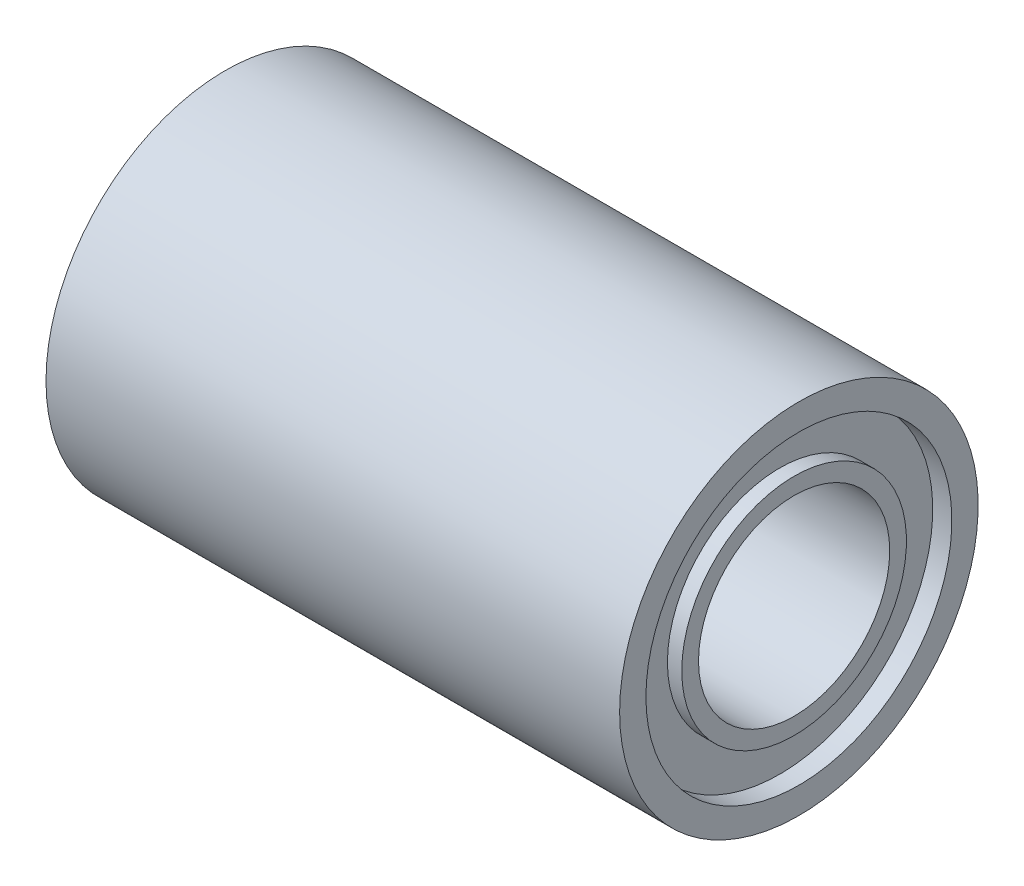
ISO-10303-21;
HEADER;
FILE_DESCRIPTION(('STEP AP214'),'2;1');
FILE_NAME('part.step','',(''),(''),'','','');
FILE_SCHEMA(('AUTOMOTIVE_DESIGN { 1 0 10303 214 1 1 1 1 }'));
ENDSEC;
DATA;
#1=APPLICATION_CONTEXT('core data for automotive mechanical design processes');
#2=APPLICATION_PROTOCOL_DEFINITION('international standard','automotive_design',2000,#1);
#3=PRODUCT_CONTEXT('',#1,'mechanical');
#4=PRODUCT('Part','Part','',(#3));
#5=PRODUCT_RELATED_PRODUCT_CATEGORY('part','',(#4));
#6=PRODUCT_DEFINITION_FORMATION('','',#4);
#7=PRODUCT_DEFINITION_CONTEXT('part definition',#1,'design');
#8=PRODUCT_DEFINITION('design','',#6,#7);
#9=PRODUCT_DEFINITION_SHAPE('','',#8);
#10=(LENGTH_UNIT() NAMED_UNIT(*) SI_UNIT(.MILLI.,.METRE.));
#11=(NAMED_UNIT(*) PLANE_ANGLE_UNIT() SI_UNIT($,.RADIAN.));
#12=(NAMED_UNIT(*) SI_UNIT($,.STERADIAN.) SOLID_ANGLE_UNIT());
#13=UNCERTAINTY_MEASURE_WITH_UNIT(LENGTH_MEASURE(1.E-05),#10,'distance_accuracy_value','');
#14=(GEOMETRIC_REPRESENTATION_CONTEXT(3) GLOBAL_UNCERTAINTY_ASSIGNED_CONTEXT((#13)) GLOBAL_UNIT_ASSIGNED_CONTEXT((#10,
#11,#12)) REPRESENTATION_CONTEXT('',''));
#15=CARTESIAN_POINT('',(0.,0.,0.));
#16=DIRECTION('',(0.,0.,1.));
#17=DIRECTION('',(1.,0.,0.));
#18=AXIS2_PLACEMENT_3D('',#15,#16,#17);
#19=CARTESIAN_POINT('',(12.,7.5,0.));
#20=DIRECTION('',(-1.,0.,0.));
#21=DIRECTION('',(0.,0.,1.));
#22=AXIS2_PLACEMENT_3D('',#19,#20,#21);
#23=PLANE('',#22);
#24=CARTESIAN_POINT('',(12.,0.,0.));
#25=DIRECTION('',(-1.,0.,0.));
#26=DIRECTION('',(0.,0.,1.));
#27=AXIS2_PLACEMENT_3D('',#24,#25,#26);
#28=CIRCLE('',#27,7.5);
#29=CARTESIAN_POINT('',(12.,0.,7.5));
#30=VERTEX_POINT('',#29);
#31=EDGE_CURVE('E75',#30,#30,#28,.T.);
#32=ORIENTED_EDGE('',*,*,#31,.F.);
#33=EDGE_LOOP('',(#32));
#34=FACE_BOUND('',#33,.T.);
#35=CARTESIAN_POINT('',(12.,0.,0.));
#36=DIRECTION('',(-1.,0.,0.));
#37=DIRECTION('',(0.,0.,1.));
#38=AXIS2_PLACEMENT_3D('',#35,#36,#37);
#39=CIRCLE('',#38,6.4);
#40=CARTESIAN_POINT('',(12.,0.,6.4));
#41=VERTEX_POINT('',#40);
#42=EDGE_CURVE('E10',#41,#41,#39,.T.);
#43=ORIENTED_EDGE('',*,*,#42,.T.);
#44=EDGE_LOOP('',(#43));
#45=FACE_BOUND('',#44,.T.);
#46=ADVANCED_FACE('F35',(#34,#45),#23,.F.);
#47=CARTESIAN_POINT('',(-30.2753079001879,0.,0.));
#48=DIRECTION('',(-1.,0.,0.));
#49=DIRECTION('',(0.,0.,1.));
#50=AXIS2_PLACEMENT_3D('',#47,#48,#49);
#51=CYLINDRICAL_SURFACE('',#50,6.4);
#52=ORIENTED_EDGE('',*,*,#42,.F.);
#53=EDGE_LOOP('',(#52));
#54=FACE_BOUND('',#53,.T.);
#55=CARTESIAN_POINT('',(11.2,0.,0.));
#56=DIRECTION('',(-1.,0.,0.));
#57=DIRECTION('',(0.,0.,1.));
#58=AXIS2_PLACEMENT_3D('',#55,#56,#57);
#59=CIRCLE('',#58,6.4);
#60=CARTESIAN_POINT('',(11.2,0.,6.4));
#61=VERTEX_POINT('',#60);
#62=EDGE_CURVE('E41',#61,#61,#59,.T.);
#63=ORIENTED_EDGE('',*,*,#62,.T.);
#64=EDGE_LOOP('',(#63));
#65=FACE_BOUND('',#64,.T.);
#66=ADVANCED_FACE('F82',(#54,#65),#51,.F.);
#67=CARTESIAN_POINT('',(11.2,6.4,0.));
#68=DIRECTION('',(-1.,0.,0.));
#69=DIRECTION('',(0.,0.,1.));
#70=AXIS2_PLACEMENT_3D('',#67,#68,#69);
#71=PLANE('',#70);
#72=ORIENTED_EDGE('',*,*,#62,.F.);
#73=EDGE_LOOP('',(#72));
#74=FACE_BOUND('',#73,.T.);
#75=CARTESIAN_POINT('',(11.2,0.,0.));
#76=DIRECTION('',(-1.,0.,0.));
#77=DIRECTION('',(0.,0.,1.));
#78=AXIS2_PLACEMENT_3D('',#75,#76,#77);
#79=CIRCLE('',#78,4.7);
#80=CARTESIAN_POINT('',(11.2,0.,4.7));
#81=VERTEX_POINT('',#80);
#82=EDGE_CURVE('E45',#81,#81,#79,.T.);
#83=ORIENTED_EDGE('',*,*,#82,.T.);
#84=EDGE_LOOP('',(#83));
#85=FACE_BOUND('',#84,.T.);
#86=ADVANCED_FACE('F86',(#74,#85),#71,.F.);
#87=CARTESIAN_POINT('',(-30.2753079001879,0.,0.));
#88=DIRECTION('',(-1.,0.,0.));
#89=DIRECTION('',(0.,0.,1.));
#90=AXIS2_PLACEMENT_3D('',#87,#88,#89);
#91=CYLINDRICAL_SURFACE('',#90,4.7);
#92=ORIENTED_EDGE('',*,*,#82,.F.);
#93=EDGE_LOOP('',(#92));
#94=FACE_BOUND('',#93,.T.);
#95=CARTESIAN_POINT('',(11.8,0.,0.));
#96=DIRECTION('',(-1.,0.,0.));
#97=DIRECTION('',(0.,0.,1.));
#98=AXIS2_PLACEMENT_3D('',#95,#96,#97);
#99=CIRCLE('',#98,4.7);
#100=CARTESIAN_POINT('',(11.8,0.,4.7));
#101=VERTEX_POINT('',#100);
#102=EDGE_CURVE('E49',#101,#101,#99,.T.);
#103=ORIENTED_EDGE('',*,*,#102,.T.);
#104=EDGE_LOOP('',(#103));
#105=FACE_BOUND('',#104,.T.);
#106=ADVANCED_FACE('F91',(#94,#105),#91,.T.);
#107=CARTESIAN_POINT('',(11.8,4.7,0.));
#108=DIRECTION('',(-1.,0.,0.));
#109=DIRECTION('',(0.,0.,1.));
#110=AXIS2_PLACEMENT_3D('',#107,#108,#109);
#111=PLANE('',#110);
#112=ORIENTED_EDGE('',*,*,#102,.F.);
#113=EDGE_LOOP('',(#112));
#114=FACE_BOUND('',#113,.T.);
#115=CARTESIAN_POINT('',(11.8,0.,0.));
#116=DIRECTION('',(-1.,0.,0.));
#117=DIRECTION('',(0.,0.,1.));
#118=AXIS2_PLACEMENT_3D('',#115,#116,#117);
#119=CIRCLE('',#118,4.);
#120=CARTESIAN_POINT('',(11.8,0.,4.));
#121=VERTEX_POINT('',#120);
#122=EDGE_CURVE('E54',#121,#121,#119,.T.);
#123=ORIENTED_EDGE('',*,*,#122,.T.);
#124=EDGE_LOOP('',(#123));
#125=FACE_BOUND('',#124,.T.);
#126=ADVANCED_FACE('F97',(#114,#125),#111,.F.);
#127=CARTESIAN_POINT('',(-30.2753079001879,0.,0.));
#128=DIRECTION('',(-1.,0.,0.));
#129=DIRECTION('',(0.,0.,1.));
#130=AXIS2_PLACEMENT_3D('',#127,#128,#129);
#131=CYLINDRICAL_SURFACE('',#130,4.);
#132=ORIENTED_EDGE('',*,*,#122,.F.);
#133=EDGE_LOOP('',(#132));
#134=FACE_BOUND('',#133,.T.);
#135=CARTESIAN_POINT('',(-11.8,0.,0.));
#136=DIRECTION('',(-1.,0.,0.));
#137=DIRECTION('',(0.,0.,1.));
#138=AXIS2_PLACEMENT_3D('',#135,#136,#137);
#139=CIRCLE('',#138,4.);
#140=CARTESIAN_POINT('',(-11.8,0.,4.));
#141=VERTEX_POINT('',#140);
#142=EDGE_CURVE('E57',#141,#141,#139,.T.);
#143=ORIENTED_EDGE('',*,*,#142,.T.);
#144=EDGE_LOOP('',(#143));
#145=FACE_BOUND('',#144,.T.);
#146=ADVANCED_FACE('F101',(#134,#145),#131,.F.);
#147=CARTESIAN_POINT('',(-11.8,4.7,0.));
#148=DIRECTION('',(1.,0.,0.));
#149=DIRECTION('',(0.,0.,-1.));
#150=AXIS2_PLACEMENT_3D('',#147,#148,#149);
#151=PLANE('',#150);
#152=ORIENTED_EDGE('',*,*,#142,.F.);
#153=EDGE_LOOP('',(#152));
#154=FACE_BOUND('',#153,.T.);
#155=CARTESIAN_POINT('',(-11.8,0.,0.));
#156=DIRECTION('',(-1.,0.,0.));
#157=DIRECTION('',(0.,0.,1.));
#158=AXIS2_PLACEMENT_3D('',#155,#156,#157);
#159=CIRCLE('',#158,4.7);
#160=CARTESIAN_POINT('',(-11.8,0.,4.7));
#161=VERTEX_POINT('',#160);
#162=EDGE_CURVE('E60',#161,#161,#159,.T.);
#163=ORIENTED_EDGE('',*,*,#162,.T.);
#164=EDGE_LOOP('',(#163));
#165=FACE_BOUND('',#164,.T.);
#166=ADVANCED_FACE('F105',(#154,#165),#151,.F.);
#167=CARTESIAN_POINT('',(-30.2753079001879,0.,0.));
#168=DIRECTION('',(-1.,0.,0.));
#169=DIRECTION('',(0.,0.,1.));
#170=AXIS2_PLACEMENT_3D('',#167,#168,#169);
#171=CYLINDRICAL_SURFACE('',#170,4.7);
#172=ORIENTED_EDGE('',*,*,#162,.F.);
#173=EDGE_LOOP('',(#172));
#174=FACE_BOUND('',#173,.T.);
#175=CARTESIAN_POINT('',(-11.2,0.,0.));
#176=DIRECTION('',(-1.,0.,0.));
#177=DIRECTION('',(0.,0.,1.));
#178=AXIS2_PLACEMENT_3D('',#175,#176,#177);
#179=CIRCLE('',#178,4.7);
#180=CARTESIAN_POINT('',(-11.2,0.,4.7));
#181=VERTEX_POINT('',#180);
#182=EDGE_CURVE('E63',#181,#181,#179,.T.);
#183=ORIENTED_EDGE('',*,*,#182,.T.);
#184=EDGE_LOOP('',(#183));
#185=FACE_BOUND('',#184,.T.);
#186=ADVANCED_FACE('F109',(#174,#185),#171,.T.);
#187=CARTESIAN_POINT('',(-11.2,6.4,0.));
#188=DIRECTION('',(1.,0.,0.));
#189=DIRECTION('',(0.,0.,-1.));
#190=AXIS2_PLACEMENT_3D('',#187,#188,#189);
#191=PLANE('',#190);
#192=ORIENTED_EDGE('',*,*,#182,.F.);
#193=EDGE_LOOP('',(#192));
#194=FACE_BOUND('',#193,.T.);
#195=CARTESIAN_POINT('',(-11.2,0.,0.));
#196=DIRECTION('',(-1.,0.,0.));
#197=DIRECTION('',(0.,0.,1.));
#198=AXIS2_PLACEMENT_3D('',#195,#196,#197);
#199=CIRCLE('',#198,6.4);
#200=CARTESIAN_POINT('',(-11.2,0.,6.4));
#201=VERTEX_POINT('',#200);
#202=EDGE_CURVE('E66',#201,#201,#199,.T.);
#203=ORIENTED_EDGE('',*,*,#202,.T.);
#204=EDGE_LOOP('',(#203));
#205=FACE_BOUND('',#204,.T.);
#206=ADVANCED_FACE('F113',(#194,#205),#191,.F.);
#207=CARTESIAN_POINT('',(-30.2753079001879,0.,0.));
#208=DIRECTION('',(-1.,0.,0.));
#209=DIRECTION('',(0.,0.,1.));
#210=AXIS2_PLACEMENT_3D('',#207,#208,#209);
#211=CYLINDRICAL_SURFACE('',#210,6.4);
#212=ORIENTED_EDGE('',*,*,#202,.F.);
#213=EDGE_LOOP('',(#212));
#214=FACE_BOUND('',#213,.T.);
#215=CARTESIAN_POINT('',(-12.,0.,0.));
#216=DIRECTION('',(-1.,0.,0.));
#217=DIRECTION('',(0.,0.,1.));
#218=AXIS2_PLACEMENT_3D('',#215,#216,#217);
#219=CIRCLE('',#218,6.4);
#220=CARTESIAN_POINT('',(-12.,0.,6.4));
#221=VERTEX_POINT('',#220);
#222=EDGE_CURVE('E69',#221,#221,#219,.T.);
#223=ORIENTED_EDGE('',*,*,#222,.T.);
#224=EDGE_LOOP('',(#223));
#225=FACE_BOUND('',#224,.T.);
#226=ADVANCED_FACE('F117',(#214,#225),#211,.F.);
#227=CARTESIAN_POINT('',(-12.,7.5,0.));
#228=DIRECTION('',(1.,0.,0.));
#229=DIRECTION('',(0.,0.,-1.));
#230=AXIS2_PLACEMENT_3D('',#227,#228,#229);
#231=PLANE('',#230);
#232=ORIENTED_EDGE('',*,*,#222,.F.);
#233=EDGE_LOOP('',(#232));
#234=FACE_BOUND('',#233,.T.);
#235=CARTESIAN_POINT('',(-12.,0.,0.));
#236=DIRECTION('',(-1.,0.,0.));
#237=DIRECTION('',(0.,0.,1.));
#238=AXIS2_PLACEMENT_3D('',#235,#236,#237);
#239=CIRCLE('',#238,7.5);
#240=CARTESIAN_POINT('',(-12.,0.,7.5));
#241=VERTEX_POINT('',#240);
#242=EDGE_CURVE('E72',#241,#241,#239,.T.);
#243=ORIENTED_EDGE('',*,*,#242,.T.);
#244=EDGE_LOOP('',(#243));
#245=FACE_BOUND('',#244,.T.);
#246=ADVANCED_FACE('F121',(#234,#245),#231,.F.);
#247=CARTESIAN_POINT('',(-30.2753079001879,0.,0.));
#248=DIRECTION('',(-1.,0.,0.));
#249=DIRECTION('',(0.,0.,1.));
#250=AXIS2_PLACEMENT_3D('',#247,#248,#249);
#251=CYLINDRICAL_SURFACE('',#250,7.5);
#252=ORIENTED_EDGE('',*,*,#242,.F.);
#253=EDGE_LOOP('',(#252));
#254=FACE_BOUND('',#253,.T.);
#255=ORIENTED_EDGE('',*,*,#31,.T.);
#256=EDGE_LOOP('',(#255));
#257=FACE_BOUND('',#256,.T.);
#258=ADVANCED_FACE('F79',(#254,#257),#251,.T.);
#259=CLOSED_SHELL('',(#46,#66,#86,#106,#126,#146,#166,#186,#206,#226,#246,#258));
#260=MANIFOLD_SOLID_BREP('B2',#259);
#261=ADVANCED_BREP_SHAPE_REPRESENTATION('',(#18,#260),#14);
#262=SHAPE_DEFINITION_REPRESENTATION(#9,#261);
ENDSEC;
END-ISO-10303-21;
